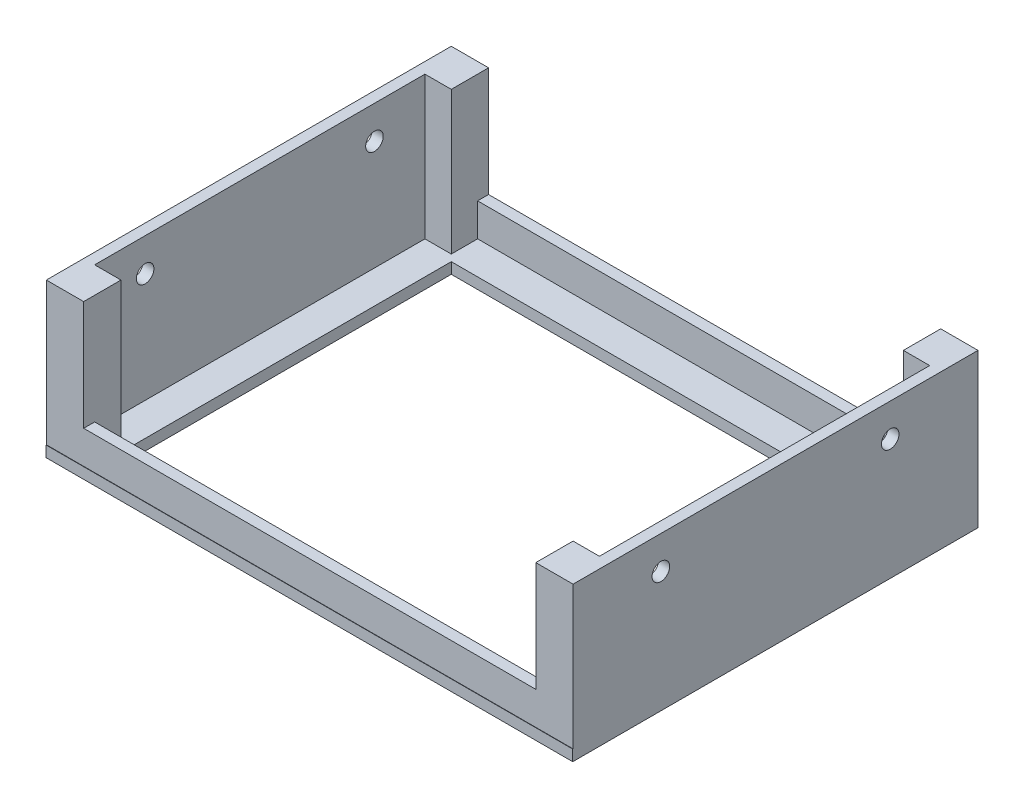
ISO-10303-21;
HEADER;
FILE_DESCRIPTION(('STEP AP214'),'2;1');
FILE_NAME('part.step','',(''),(''),'','','');
FILE_SCHEMA(('AUTOMOTIVE_DESIGN { 1 0 10303 214 1 1 1 1 }'));
ENDSEC;
DATA;
#1=APPLICATION_CONTEXT('core data for automotive mechanical design processes');
#2=APPLICATION_PROTOCOL_DEFINITION('international standard','automotive_design',2000,#1);
#3=PRODUCT_CONTEXT('',#1,'mechanical');
#4=PRODUCT('Part','Part','',(#3));
#5=PRODUCT_RELATED_PRODUCT_CATEGORY('part','',(#4));
#6=PRODUCT_DEFINITION_FORMATION('','',#4);
#7=PRODUCT_DEFINITION_CONTEXT('part definition',#1,'design');
#8=PRODUCT_DEFINITION('design','',#6,#7);
#9=PRODUCT_DEFINITION_SHAPE('','',#8);
#10=(LENGTH_UNIT() NAMED_UNIT(*) SI_UNIT(.MILLI.,.METRE.));
#11=(NAMED_UNIT(*) PLANE_ANGLE_UNIT() SI_UNIT($,.RADIAN.));
#12=(NAMED_UNIT(*) SI_UNIT($,.STERADIAN.) SOLID_ANGLE_UNIT());
#13=UNCERTAINTY_MEASURE_WITH_UNIT(LENGTH_MEASURE(1.E-05),#10,'distance_accuracy_value','');
#14=(GEOMETRIC_REPRESENTATION_CONTEXT(3) GLOBAL_UNCERTAINTY_ASSIGNED_CONTEXT((#13)) GLOBAL_UNIT_ASSIGNED_CONTEXT((#10,
#11,#12)) REPRESENTATION_CONTEXT('',''));
#15=CARTESIAN_POINT('',(0.,0.,0.));
#16=DIRECTION('',(0.,0.,1.));
#17=DIRECTION('',(1.,0.,0.));
#18=AXIS2_PLACEMENT_3D('',#15,#16,#17);
#19=CARTESIAN_POINT('',(120.,70.,92.25));
#20=DIRECTION('',(0.,0.,1.));
#21=DIRECTION('',(1.,0.,0.));
#22=AXIS2_PLACEMENT_3D('',#19,#20,#21);
#23=PLANE('',#22);
#24=DIRECTION('',(0.,-1.,0.));
#25=VECTOR('',#24,1.);
#26=CARTESIAN_POINT('',(-120.,70.,92.25));
#27=LINE('',#26,#25);
#28=CARTESIAN_POINT('',(-120.,70.,92.25));
#29=VERTEX_POINT('',#28);
#30=CARTESIAN_POINT('',(-120.,5.,92.25));
#31=VERTEX_POINT('',#30);
#32=EDGE_CURVE('E511',#29,#31,#27,.T.);
#33=ORIENTED_EDGE('',*,*,#32,.T.);
#34=DIRECTION('',(1.,0.,0.));
#35=VECTOR('',#34,1.);
#36=CARTESIAN_POINT('',(120.,5.,92.25));
#37=LINE('',#36,#35);
#38=CARTESIAN_POINT('',(120.,5.,92.25));
#39=VERTEX_POINT('',#38);
#40=EDGE_CURVE('E398',#31,#39,#37,.T.);
#41=ORIENTED_EDGE('',*,*,#40,.T.);
#42=DIRECTION('',(0.,-1.,0.));
#43=VECTOR('',#42,1.);
#44=CARTESIAN_POINT('',(120.,70.,92.25));
#45=LINE('',#44,#43);
#46=CARTESIAN_POINT('',(120.,70.,92.25));
#47=VERTEX_POINT('',#46);
#48=EDGE_CURVE('E501',#47,#39,#45,.T.);
#49=ORIENTED_EDGE('',*,*,#48,.F.);
#50=DIRECTION('',(-1.,0.,0.));
#51=VECTOR('',#50,1.);
#52=CARTESIAN_POINT('',(120.,70.,92.25));
#53=LINE('',#52,#51);
#54=CARTESIAN_POINT('',(103.,70.,92.25));
#55=VERTEX_POINT('',#54);
#56=EDGE_CURVE('E498',#47,#55,#53,.T.);
#57=ORIENTED_EDGE('',*,*,#56,.T.);
#58=DIRECTION('',(0.,-1.,0.));
#59=VECTOR('',#58,1.);
#60=CARTESIAN_POINT('',(103.,70.,92.25));
#61=LINE('',#60,#59);
#62=CARTESIAN_POINT('',(103.,20.,92.25));
#63=VERTEX_POINT('',#62);
#64=EDGE_CURVE('E401',#55,#63,#61,.T.);
#65=ORIENTED_EDGE('',*,*,#64,.T.);
#66=DIRECTION('',(1.,0.,0.));
#67=VECTOR('',#66,1.);
#68=CARTESIAN_POINT('',(-103.,20.,92.25));
#69=LINE('',#68,#67);
#70=CARTESIAN_POINT('',(-103.,20.,92.25));
#71=VERTEX_POINT('',#70);
#72=EDGE_CURVE('E414',#71,#63,#69,.T.);
#73=ORIENTED_EDGE('',*,*,#72,.F.);
#74=DIRECTION('',(0.,-1.,0.));
#75=VECTOR('',#74,1.);
#76=CARTESIAN_POINT('',(-103.,70.,92.25));
#77=LINE('',#76,#75);
#78=CARTESIAN_POINT('',(-103.,70.,92.25));
#79=VERTEX_POINT('',#78);
#80=EDGE_CURVE('E405',#79,#71,#77,.T.);
#81=ORIENTED_EDGE('',*,*,#80,.F.);
#82=EDGE_CURVE('E497',#79,#29,#53,.T.);
#83=ORIENTED_EDGE('',*,*,#82,.T.);
#84=EDGE_LOOP('',(#33,#41,#49,#57,#65,#73,#81,#83));
#85=FACE_BOUND('',#84,.T.);
#86=ADVANCED_FACE('F104',(#85),#23,.T.);
#87=CARTESIAN_POINT('',(-115.,70.,75.25));
#88=DIRECTION('',(0.,0.,-1.));
#89=DIRECTION('',(-1.,0.,0.));
#90=AXIS2_PLACEMENT_3D('',#87,#88,#89);
#91=PLANE('',#90);
#92=DIRECTION('',(0.,-1.,0.));
#93=VECTOR('',#92,1.);
#94=CARTESIAN_POINT('',(-103.,70.,75.25));
#95=LINE('',#94,#93);
#96=CARTESIAN_POINT('',(-103.,70.,75.25));
#97=VERTEX_POINT('',#96);
#98=CARTESIAN_POINT('',(-103.,5.,75.25));
#99=VERTEX_POINT('',#98);
#100=EDGE_CURVE('E483',#97,#99,#95,.T.);
#101=ORIENTED_EDGE('',*,*,#100,.T.);
#102=DIRECTION('',(-1.,0.,0.));
#103=VECTOR('',#102,1.);
#104=CARTESIAN_POINT('',(-115.,5.,75.25));
#105=LINE('',#104,#103);
#106=CARTESIAN_POINT('',(-115.,5.,75.25));
#107=VERTEX_POINT('',#106);
#108=EDGE_CURVE('E395',#99,#107,#105,.T.);
#109=ORIENTED_EDGE('',*,*,#108,.T.);
#110=DIRECTION('',(0.,-1.,0.));
#111=VECTOR('',#110,1.);
#112=CARTESIAN_POINT('',(-115.,70.,75.25));
#113=LINE('',#112,#111);
#114=CARTESIAN_POINT('',(-115.,70.,75.25));
#115=VERTEX_POINT('',#114);
#116=EDGE_CURVE('E453',#115,#107,#113,.T.);
#117=ORIENTED_EDGE('',*,*,#116,.F.);
#118=DIRECTION('',(1.,0.,0.));
#119=VECTOR('',#118,1.);
#120=CARTESIAN_POINT('',(-115.,70.,75.25));
#121=LINE('',#120,#119);
#122=EDGE_CURVE('E430',#115,#97,#121,.T.);
#123=ORIENTED_EDGE('',*,*,#122,.T.);
#124=EDGE_LOOP('',(#101,#109,#117,#123));
#125=FACE_BOUND('',#124,.T.);
#126=ADVANCED_FACE('F577',(#125),#91,.T.);
#127=CARTESIAN_POINT('',(-103.,70.,75.25));
#128=DIRECTION('',(1.,0.,0.));
#129=DIRECTION('',(0.,0.,-1.));
#130=AXIS2_PLACEMENT_3D('',#127,#128,#129);
#131=PLANE('',#130);
#132=DIRECTION('',(0.,-1.,0.));
#133=VECTOR('',#132,1.);
#134=CARTESIAN_POINT('',(-103.,70.,87.25));
#135=LINE('',#134,#133);
#136=CARTESIAN_POINT('',(-103.,20.,87.25));
#137=VERTEX_POINT('',#136);
#138=CARTESIAN_POINT('',(-103.,5.,87.25));
#139=VERTEX_POINT('',#138);
#140=EDGE_CURVE('E481',#137,#139,#135,.T.);
#141=ORIENTED_EDGE('',*,*,#140,.T.);
#142=DIRECTION('',(0.,0.,-1.));
#143=VECTOR('',#142,1.);
#144=CARTESIAN_POINT('',(-103.,5.,75.25));
#145=LINE('',#144,#143);
#146=EDGE_CURVE('E119',#139,#99,#145,.T.);
#147=ORIENTED_EDGE('',*,*,#146,.T.);
#148=ORIENTED_EDGE('',*,*,#100,.F.);
#149=DIRECTION('',(0.,0.,1.));
#150=VECTOR('',#149,1.);
#151=CARTESIAN_POINT('',(-103.,70.,75.25));
#152=LINE('',#151,#150);
#153=EDGE_CURVE('E432',#97,#79,#152,.T.);
#154=ORIENTED_EDGE('',*,*,#153,.T.);
#155=ORIENTED_EDGE('',*,*,#80,.T.);
#156=DIRECTION('',(0.,0.,1.));
#157=VECTOR('',#156,1.);
#158=CARTESIAN_POINT('',(-103.,20.,-92.25));
#159=LINE('',#158,#157);
#160=EDGE_CURVE('E411',#137,#71,#159,.T.);
#161=ORIENTED_EDGE('',*,*,#160,.F.);
#162=EDGE_LOOP('',(#141,#147,#148,#154,#155,#161));
#163=FACE_BOUND('',#162,.T.);
#164=ADVANCED_FACE('F582',(#163),#131,.T.);
#165=CARTESIAN_POINT('',(103.,70.,87.25));
#166=DIRECTION('',(0.,0.,1.));
#167=DIRECTION('',(1.,0.,0.));
#168=AXIS2_PLACEMENT_3D('',#165,#166,#167);
#169=PLANE('',#168);
#170=DIRECTION('',(1.,0.,0.));
#171=VECTOR('',#170,1.);
#172=CARTESIAN_POINT('',(103.,5.,87.25));
#173=LINE('',#172,#171);
#174=CARTESIAN_POINT('',(103.,5.,87.25));
#175=VERTEX_POINT('',#174);
#176=EDGE_CURVE('E127',#139,#175,#173,.T.);
#177=ORIENTED_EDGE('',*,*,#176,.F.);
#178=ORIENTED_EDGE('',*,*,#140,.F.);
#179=DIRECTION('',(1.,0.,0.));
#180=VECTOR('',#179,1.);
#181=CARTESIAN_POINT('',(103.,20.,87.25));
#182=LINE('',#181,#180);
#183=CARTESIAN_POINT('',(103.,20.,87.25));
#184=VERTEX_POINT('',#183);
#185=EDGE_CURVE('E427',#137,#184,#182,.T.);
#186=ORIENTED_EDGE('',*,*,#185,.T.);
#187=DIRECTION('',(0.,-1.,0.));
#188=VECTOR('',#187,1.);
#189=CARTESIAN_POINT('',(103.,70.,87.25));
#190=LINE('',#189,#188);
#191=EDGE_CURVE('E479',#184,#175,#190,.T.);
#192=ORIENTED_EDGE('',*,*,#191,.T.);
#193=EDGE_LOOP('',(#177,#178,#186,#192));
#194=FACE_BOUND('',#193,.T.);
#195=ADVANCED_FACE('F606',(#194),#169,.F.);
#196=CARTESIAN_POINT('',(103.,70.,75.25));
#197=DIRECTION('',(1.,0.,0.));
#198=DIRECTION('',(0.,0.,-1.));
#199=AXIS2_PLACEMENT_3D('',#196,#197,#198);
#200=PLANE('',#199);
#201=DIRECTION('',(0.,0.,-1.));
#202=VECTOR('',#201,1.);
#203=CARTESIAN_POINT('',(103.,5.,75.25));
#204=LINE('',#203,#202);
#205=CARTESIAN_POINT('',(103.,5.,75.25));
#206=VERTEX_POINT('',#205);
#207=EDGE_CURVE('E390',#175,#206,#204,.T.);
#208=ORIENTED_EDGE('',*,*,#207,.F.);
#209=ORIENTED_EDGE('',*,*,#191,.F.);
#210=DIRECTION('',(0.,0.,1.));
#211=VECTOR('',#210,1.);
#212=CARTESIAN_POINT('',(103.,20.,-92.25));
#213=LINE('',#212,#211);
#214=EDGE_CURVE('E421',#184,#63,#213,.T.);
#215=ORIENTED_EDGE('',*,*,#214,.T.);
#216=ORIENTED_EDGE('',*,*,#64,.F.);
#217=DIRECTION('',(0.,0.,1.));
#218=VECTOR('',#217,1.);
#219=CARTESIAN_POINT('',(103.,70.,75.25));
#220=LINE('',#219,#218);
#221=CARTESIAN_POINT('',(103.,70.,75.25));
#222=VERTEX_POINT('',#221);
#223=EDGE_CURVE('E434',#222,#55,#220,.T.);
#224=ORIENTED_EDGE('',*,*,#223,.F.);
#225=DIRECTION('',(0.,-1.,0.));
#226=VECTOR('',#225,1.);
#227=CARTESIAN_POINT('',(103.,70.,75.25));
#228=LINE('',#227,#226);
#229=EDGE_CURVE('E476',#222,#206,#228,.T.);
#230=ORIENTED_EDGE('',*,*,#229,.T.);
#231=EDGE_LOOP('',(#208,#209,#215,#216,#224,#230));
#232=FACE_BOUND('',#231,.T.);
#233=ADVANCED_FACE('F609',(#232),#200,.F.);
#234=CARTESIAN_POINT('',(115.,70.,75.25));
#235=DIRECTION('',(0.,0.,1.));
#236=DIRECTION('',(1.,0.,0.));
#237=AXIS2_PLACEMENT_3D('',#234,#235,#236);
#238=PLANE('',#237);
#239=DIRECTION('',(1.,0.,0.));
#240=VECTOR('',#239,1.);
#241=CARTESIAN_POINT('',(115.,5.,75.25));
#242=LINE('',#241,#240);
#243=CARTESIAN_POINT('',(115.,5.,75.25));
#244=VERTEX_POINT('',#243);
#245=EDGE_CURVE('E387',#206,#244,#242,.T.);
#246=ORIENTED_EDGE('',*,*,#245,.F.);
#247=ORIENTED_EDGE('',*,*,#229,.F.);
#248=DIRECTION('',(-1.,0.,0.));
#249=VECTOR('',#248,1.);
#250=CARTESIAN_POINT('',(115.,70.,75.25));
#251=LINE('',#250,#249);
#252=CARTESIAN_POINT('',(115.,70.,75.25));
#253=VERTEX_POINT('',#252);
#254=EDGE_CURVE('E436',#253,#222,#251,.T.);
#255=ORIENTED_EDGE('',*,*,#254,.F.);
#256=DIRECTION('',(0.,-1.,0.));
#257=VECTOR('',#256,1.);
#258=CARTESIAN_POINT('',(115.,70.,75.25));
#259=LINE('',#258,#257);
#260=EDGE_CURVE('E473',#253,#244,#259,.T.);
#261=ORIENTED_EDGE('',*,*,#260,.T.);
#262=EDGE_LOOP('',(#246,#247,#255,#261));
#263=FACE_BOUND('',#262,.T.);
#264=ADVANCED_FACE('F612',(#263),#238,.F.);
#265=CARTESIAN_POINT('',(115.,70.,75.25));
#266=DIRECTION('',(-1.,0.,0.));
#267=DIRECTION('',(0.,0.,1.));
#268=AXIS2_PLACEMENT_3D('',#265,#266,#267);
#269=PLANE('',#268);
#270=CARTESIAN_POINT('',(115.,55.,52.25));
#271=DIRECTION('',(-1.,0.,0.));
#272=DIRECTION('',(0.,0.,1.));
#273=AXIS2_PLACEMENT_3D('',#270,#271,#272);
#274=CIRCLE('',#273,3.99999999999998);
#275=CARTESIAN_POINT('',(115.,55.,56.25));
#276=VERTEX_POINT('',#275);
#277=EDGE_CURVE('E841',#276,#276,#274,.T.);
#278=ORIENTED_EDGE('',*,*,#277,.F.);
#279=EDGE_LOOP('',(#278));
#280=FACE_BOUND('',#279,.T.);
#281=CARTESIAN_POINT('',(115.,55.,-52.25));
#282=DIRECTION('',(-1.,0.,0.));
#283=DIRECTION('',(0.,0.,1.));
#284=AXIS2_PLACEMENT_3D('',#281,#282,#283);
#285=CIRCLE('',#284,3.99999999999998);
#286=CARTESIAN_POINT('',(115.,55.,-48.2500000000001));
#287=VERTEX_POINT('',#286);
#288=EDGE_CURVE('E307',#287,#287,#285,.T.);
#289=ORIENTED_EDGE('',*,*,#288,.F.);
#290=EDGE_LOOP('',(#289));
#291=FACE_BOUND('',#290,.T.);
#292=DIRECTION('',(0.,-1.,0.));
#293=VECTOR('',#292,1.);
#294=CARTESIAN_POINT('',(115.,70.,-75.25));
#295=LINE('',#294,#293);
#296=CARTESIAN_POINT('',(115.,70.,-75.25));
#297=VERTEX_POINT('',#296);
#298=CARTESIAN_POINT('',(115.,5.,-75.25));
#299=VERTEX_POINT('',#298);
#300=EDGE_CURVE('E470',#297,#299,#295,.T.);
#301=ORIENTED_EDGE('',*,*,#300,.T.);
#302=DIRECTION('',(0.,0.,1.));
#303=VECTOR('',#302,1.);
#304=CARTESIAN_POINT('',(115.,5.,75.25));
#305=LINE('',#304,#303);
#306=EDGE_CURVE('E385',#299,#244,#305,.T.);
#307=ORIENTED_EDGE('',*,*,#306,.T.);
#308=ORIENTED_EDGE('',*,*,#260,.F.);
#309=DIRECTION('',(0.,0.,-1.));
#310=VECTOR('',#309,1.);
#311=CARTESIAN_POINT('',(115.,70.,75.25));
#312=LINE('',#311,#310);
#313=EDGE_CURVE('E439',#253,#297,#312,.T.);
#314=ORIENTED_EDGE('',*,*,#313,.T.);
#315=EDGE_LOOP('',(#301,#307,#308,#314));
#316=FACE_BOUND('',#315,.T.);
#317=ADVANCED_FACE('F616',(#280,#291,#316),#269,.T.);
#318=CARTESIAN_POINT('',(115.,70.,-75.25));
#319=DIRECTION('',(0.,0.,1.));
#320=DIRECTION('',(1.,0.,0.));
#321=AXIS2_PLACEMENT_3D('',#318,#319,#320);
#322=PLANE('',#321);
#323=DIRECTION('',(0.,-1.,0.));
#324=VECTOR('',#323,1.);
#325=CARTESIAN_POINT('',(103.,70.,-75.25));
#326=LINE('',#325,#324);
#327=CARTESIAN_POINT('',(103.,70.,-75.25));
#328=VERTEX_POINT('',#327);
#329=CARTESIAN_POINT('',(103.,5.,-75.25));
#330=VERTEX_POINT('',#329);
#331=EDGE_CURVE('E467',#328,#330,#326,.T.);
#332=ORIENTED_EDGE('',*,*,#331,.T.);
#333=DIRECTION('',(1.,0.,0.));
#334=VECTOR('',#333,1.);
#335=CARTESIAN_POINT('',(115.,5.,-75.25));
#336=LINE('',#335,#334);
#337=EDGE_CURVE('E383',#330,#299,#336,.T.);
#338=ORIENTED_EDGE('',*,*,#337,.T.);
#339=ORIENTED_EDGE('',*,*,#300,.F.);
#340=DIRECTION('',(-1.,0.,0.));
#341=VECTOR('',#340,1.);
#342=CARTESIAN_POINT('',(115.,70.,-75.25));
#343=LINE('',#342,#341);
#344=EDGE_CURVE('E441',#297,#328,#343,.T.);
#345=ORIENTED_EDGE('',*,*,#344,.T.);
#346=EDGE_LOOP('',(#332,#338,#339,#345));
#347=FACE_BOUND('',#346,.T.);
#348=ADVANCED_FACE('F620',(#347),#322,.T.);
#349=CARTESIAN_POINT('',(103.,70.,-75.25));
#350=DIRECTION('',(-1.,0.,0.));
#351=DIRECTION('',(0.,0.,1.));
#352=AXIS2_PLACEMENT_3D('',#349,#350,#351);
#353=PLANE('',#352);
#354=DIRECTION('',(0.,-1.,0.));
#355=VECTOR('',#354,1.);
#356=CARTESIAN_POINT('',(103.,70.,-87.25));
#357=LINE('',#356,#355);
#358=CARTESIAN_POINT('',(103.,20.,-87.25));
#359=VERTEX_POINT('',#358);
#360=CARTESIAN_POINT('',(103.,5.,-87.25));
#361=VERTEX_POINT('',#360);
#362=EDGE_CURVE('E464',#359,#361,#357,.T.);
#363=ORIENTED_EDGE('',*,*,#362,.T.);
#364=DIRECTION('',(0.,0.,1.));
#365=VECTOR('',#364,1.);
#366=CARTESIAN_POINT('',(103.,5.,-75.25));
#367=LINE('',#366,#365);
#368=EDGE_CURVE('E381',#361,#330,#367,.T.);
#369=ORIENTED_EDGE('',*,*,#368,.T.);
#370=ORIENTED_EDGE('',*,*,#331,.F.);
#371=DIRECTION('',(0.,0.,-1.));
#372=VECTOR('',#371,1.);
#373=CARTESIAN_POINT('',(103.,70.,-75.25));
#374=LINE('',#373,#372);
#375=CARTESIAN_POINT('',(103.,70.,-92.25));
#376=VERTEX_POINT('',#375);
#377=EDGE_CURVE('E443',#328,#376,#374,.T.);
#378=ORIENTED_EDGE('',*,*,#377,.T.);
#379=DIRECTION('',(0.,-1.,0.));
#380=VECTOR('',#379,1.);
#381=CARTESIAN_POINT('',(103.,70.,-92.25));
#382=LINE('',#381,#380);
#383=CARTESIAN_POINT('',(103.,20.,-92.25));
#384=VERTEX_POINT('',#383);
#385=EDGE_CURVE('E402',#376,#384,#382,.T.);
#386=ORIENTED_EDGE('',*,*,#385,.T.);
#387=EDGE_CURVE('E422',#384,#359,#213,.T.);
#388=ORIENTED_EDGE('',*,*,#387,.T.);
#389=EDGE_LOOP('',(#363,#369,#370,#378,#386,#388));
#390=FACE_BOUND('',#389,.T.);
#391=ADVANCED_FACE('F624',(#390),#353,.T.);
#392=CARTESIAN_POINT('',(103.,70.,-87.25));
#393=DIRECTION('',(0.,0.,1.));
#394=DIRECTION('',(1.,0.,0.));
#395=AXIS2_PLACEMENT_3D('',#392,#393,#394);
#396=PLANE('',#395);
#397=DIRECTION('',(0.,-1.,0.));
#398=VECTOR('',#397,1.);
#399=CARTESIAN_POINT('',(-103.,70.,-87.25));
#400=LINE('',#399,#398);
#401=CARTESIAN_POINT('',(-103.,20.,-87.25));
#402=VERTEX_POINT('',#401);
#403=CARTESIAN_POINT('',(-103.,5.,-87.25));
#404=VERTEX_POINT('',#403);
#405=EDGE_CURVE('E461',#402,#404,#400,.T.);
#406=ORIENTED_EDGE('',*,*,#405,.T.);
#407=DIRECTION('',(1.,0.,0.));
#408=VECTOR('',#407,1.);
#409=CARTESIAN_POINT('',(103.,5.,-87.25));
#410=LINE('',#409,#408);
#411=EDGE_CURVE('E379',#404,#361,#410,.T.);
#412=ORIENTED_EDGE('',*,*,#411,.T.);
#413=ORIENTED_EDGE('',*,*,#362,.F.);
#414=DIRECTION('',(1.,0.,0.));
#415=VECTOR('',#414,1.);
#416=CARTESIAN_POINT('',(103.,20.,-87.25));
#417=LINE('',#416,#415);
#418=EDGE_CURVE('E425',#402,#359,#417,.T.);
#419=ORIENTED_EDGE('',*,*,#418,.F.);
#420=EDGE_LOOP('',(#406,#412,#413,#419));
#421=FACE_BOUND('',#420,.T.);
#422=ADVANCED_FACE('F628',(#421),#396,.T.);
#423=CARTESIAN_POINT('',(-103.,70.,-75.25));
#424=DIRECTION('',(-1.,0.,0.));
#425=DIRECTION('',(0.,0.,1.));
#426=AXIS2_PLACEMENT_3D('',#423,#424,#425);
#427=PLANE('',#426);
#428=DIRECTION('',(0.,0.,1.));
#429=VECTOR('',#428,1.);
#430=CARTESIAN_POINT('',(-103.,5.,-75.25));
#431=LINE('',#430,#429);
#432=CARTESIAN_POINT('',(-103.,5.,-75.25));
#433=VERTEX_POINT('',#432);
#434=EDGE_CURVE('E376',#404,#433,#431,.T.);
#435=ORIENTED_EDGE('',*,*,#434,.F.);
#436=ORIENTED_EDGE('',*,*,#405,.F.);
#437=CARTESIAN_POINT('',(-103.,20.,-92.25));
#438=VERTEX_POINT('',#437);
#439=EDGE_CURVE('E419',#438,#402,#159,.T.);
#440=ORIENTED_EDGE('',*,*,#439,.F.);
#441=DIRECTION('',(0.,-1.,0.));
#442=VECTOR('',#441,1.);
#443=CARTESIAN_POINT('',(-103.,70.,-92.25));
#444=LINE('',#443,#442);
#445=CARTESIAN_POINT('',(-103.,70.,-92.25));
#446=VERTEX_POINT('',#445);
#447=EDGE_CURVE('E408',#446,#438,#444,.T.);
#448=ORIENTED_EDGE('',*,*,#447,.F.);
#449=DIRECTION('',(0.,0.,-1.));
#450=VECTOR('',#449,1.);
#451=CARTESIAN_POINT('',(-103.,70.,-75.25));
#452=LINE('',#451,#450);
#453=CARTESIAN_POINT('',(-103.,70.,-75.25));
#454=VERTEX_POINT('',#453);
#455=EDGE_CURVE('E445',#454,#446,#452,.T.);
#456=ORIENTED_EDGE('',*,*,#455,.F.);
#457=DIRECTION('',(0.,-1.,0.));
#458=VECTOR('',#457,1.);
#459=CARTESIAN_POINT('',(-103.,70.,-75.25));
#460=LINE('',#459,#458);
#461=EDGE_CURVE('E458',#454,#433,#460,.T.);
#462=ORIENTED_EDGE('',*,*,#461,.T.);
#463=EDGE_LOOP('',(#435,#436,#440,#448,#456,#462));
#464=FACE_BOUND('',#463,.T.);
#465=ADVANCED_FACE('F544',(#464),#427,.F.);
#466=CARTESIAN_POINT('',(-115.,70.,-75.25));
#467=DIRECTION('',(0.,0.,-1.));
#468=DIRECTION('',(-1.,0.,0.));
#469=AXIS2_PLACEMENT_3D('',#466,#467,#468);
#470=PLANE('',#469);
#471=DIRECTION('',(-1.,0.,0.));
#472=VECTOR('',#471,1.);
#473=CARTESIAN_POINT('',(-115.,5.,-75.25));
#474=LINE('',#473,#472);
#475=CARTESIAN_POINT('',(-115.,5.,-75.25));
#476=VERTEX_POINT('',#475);
#477=EDGE_CURVE('E371',#433,#476,#474,.T.);
#478=ORIENTED_EDGE('',*,*,#477,.F.);
#479=ORIENTED_EDGE('',*,*,#461,.F.);
#480=DIRECTION('',(1.,0.,0.));
#481=VECTOR('',#480,1.);
#482=CARTESIAN_POINT('',(-115.,70.,-75.25));
#483=LINE('',#482,#481);
#484=CARTESIAN_POINT('',(-115.,70.,-75.25));
#485=VERTEX_POINT('',#484);
#486=EDGE_CURVE('E447',#485,#454,#483,.T.);
#487=ORIENTED_EDGE('',*,*,#486,.F.);
#488=DIRECTION('',(0.,-1.,0.));
#489=VECTOR('',#488,1.);
#490=CARTESIAN_POINT('',(-115.,70.,-75.25));
#491=LINE('',#490,#489);
#492=EDGE_CURVE('E455',#485,#476,#491,.T.);
#493=ORIENTED_EDGE('',*,*,#492,.T.);
#494=EDGE_LOOP('',(#478,#479,#487,#493));
#495=FACE_BOUND('',#494,.T.);
#496=ADVANCED_FACE('F600',(#495),#470,.F.);
#497=CARTESIAN_POINT('',(-115.,70.,75.25));
#498=DIRECTION('',(-1.,0.,0.));
#499=DIRECTION('',(0.,0.,1.));
#500=AXIS2_PLACEMENT_3D('',#497,#498,#499);
#501=PLANE('',#500);
#502=CARTESIAN_POINT('',(-115.,55.,52.25));
#503=DIRECTION('',(-1.,0.,0.));
#504=DIRECTION('',(0.,0.,1.));
#505=AXIS2_PLACEMENT_3D('',#502,#503,#504);
#506=CIRCLE('',#505,3.99999999999998);
#507=CARTESIAN_POINT('',(-115.,55.,56.25));
#508=VERTEX_POINT('',#507);
#509=EDGE_CURVE('E845',#508,#508,#506,.T.);
#510=ORIENTED_EDGE('',*,*,#509,.T.);
#511=EDGE_LOOP('',(#510));
#512=FACE_BOUND('',#511,.T.);
#513=CARTESIAN_POINT('',(-115.,55.,-52.25));
#514=DIRECTION('',(-1.,0.,0.));
#515=DIRECTION('',(0.,0.,1.));
#516=AXIS2_PLACEMENT_3D('',#513,#514,#515);
#517=CIRCLE('',#516,3.99999999999998);
#518=CARTESIAN_POINT('',(-115.,55.,-48.25));
#519=VERTEX_POINT('',#518);
#520=EDGE_CURVE('E860',#519,#519,#517,.T.);
#521=ORIENTED_EDGE('',*,*,#520,.T.);
#522=EDGE_LOOP('',(#521));
#523=FACE_BOUND('',#522,.T.);
#524=DIRECTION('',(0.,0.,1.));
#525=VECTOR('',#524,1.);
#526=CARTESIAN_POINT('',(-115.,5.,75.25));
#527=LINE('',#526,#525);
#528=EDGE_CURVE('E12',#476,#107,#527,.T.);
#529=ORIENTED_EDGE('',*,*,#528,.F.);
#530=ORIENTED_EDGE('',*,*,#492,.F.);
#531=DIRECTION('',(0.,0.,-1.));
#532=VECTOR('',#531,1.);
#533=CARTESIAN_POINT('',(-115.,70.,75.25));
#534=LINE('',#533,#532);
#535=EDGE_CURVE('E450',#115,#485,#534,.T.);
#536=ORIENTED_EDGE('',*,*,#535,.F.);
#537=ORIENTED_EDGE('',*,*,#116,.T.);
#538=EDGE_LOOP('',(#529,#530,#536,#537));
#539=FACE_BOUND('',#538,.T.);
#540=ADVANCED_FACE('F595',(#512,#523,#539),#501,.F.);
#541=CARTESIAN_POINT('',(0.,70.,0.));
#542=DIRECTION('',(0.,1.,0.));
#543=DIRECTION('',(0.,0.,1.));
#544=AXIS2_PLACEMENT_3D('',#541,#542,#543);
#545=PLANE('',#544);
#546=DIRECTION('',(-1.,0.,0.));
#547=VECTOR('',#546,1.);
#548=CARTESIAN_POINT('',(120.,70.,-92.25));
#549=LINE('',#548,#547);
#550=CARTESIAN_POINT('',(120.,70.,-92.25));
#551=VERTEX_POINT('',#550);
#552=EDGE_CURVE('E491',#551,#376,#549,.T.);
#553=ORIENTED_EDGE('',*,*,#552,.T.);
#554=ORIENTED_EDGE('',*,*,#377,.F.);
#555=ORIENTED_EDGE('',*,*,#344,.F.);
#556=ORIENTED_EDGE('',*,*,#313,.F.);
#557=ORIENTED_EDGE('',*,*,#254,.T.);
#558=ORIENTED_EDGE('',*,*,#223,.T.);
#559=ORIENTED_EDGE('',*,*,#56,.F.);
#560=DIRECTION('',(0.,0.,-1.));
#561=VECTOR('',#560,1.);
#562=CARTESIAN_POINT('',(120.,70.,92.25));
#563=LINE('',#562,#561);
#564=EDGE_CURVE('E486',#47,#551,#563,.T.);
#565=ORIENTED_EDGE('',*,*,#564,.T.);
#566=EDGE_LOOP('',(#553,#554,#555,#556,#557,#558,#559,#565));
#567=FACE_BOUND('',#566,.T.);
#568=ADVANCED_FACE('F554',(#567),#545,.T.);
#569=CARTESIAN_POINT('',(120.,70.,-92.25));
#570=DIRECTION('',(0.,0.,1.));
#571=DIRECTION('',(1.,0.,0.));
#572=AXIS2_PLACEMENT_3D('',#569,#570,#571);
#573=PLANE('',#572);
#574=DIRECTION('',(-1.,0.,0.));
#575=VECTOR('',#574,1.);
#576=CARTESIAN_POINT('',(120.,0.,-92.25));
#577=LINE('',#576,#575);
#578=CARTESIAN_POINT('',(120.,0.,-92.25));
#579=VERTEX_POINT('',#578);
#580=CARTESIAN_POINT('',(-120.,0.,-92.25));
#581=VERTEX_POINT('',#580);
#582=EDGE_CURVE('E504',#579,#581,#577,.T.);
#583=ORIENTED_EDGE('',*,*,#582,.T.);
#584=DIRECTION('',(0.,-1.,0.));
#585=VECTOR('',#584,1.);
#586=CARTESIAN_POINT('',(-120.,70.,-92.25));
#587=LINE('',#586,#585);
#588=CARTESIAN_POINT('',(-120.,70.,-92.25));
#589=VERTEX_POINT('',#588);
#590=EDGE_CURVE('E514',#589,#581,#587,.T.);
#591=ORIENTED_EDGE('',*,*,#590,.F.);
#592=EDGE_CURVE('E489',#446,#589,#549,.T.);
#593=ORIENTED_EDGE('',*,*,#592,.F.);
#594=ORIENTED_EDGE('',*,*,#447,.T.);
#595=DIRECTION('',(1.,0.,0.));
#596=VECTOR('',#595,1.);
#597=CARTESIAN_POINT('',(-103.,20.,-92.25));
#598=LINE('',#597,#596);
#599=EDGE_CURVE('E404',#438,#384,#598,.T.);
#600=ORIENTED_EDGE('',*,*,#599,.T.);
#601=ORIENTED_EDGE('',*,*,#385,.F.);
#602=ORIENTED_EDGE('',*,*,#552,.F.);
#603=DIRECTION('',(0.,-1.,0.));
#604=VECTOR('',#603,1.);
#605=CARTESIAN_POINT('',(120.,70.,-92.25));
#606=LINE('',#605,#604);
#607=EDGE_CURVE('E112',#551,#579,#606,.T.);
#608=ORIENTED_EDGE('',*,*,#607,.T.);
#609=EDGE_LOOP('',(#583,#591,#593,#594,#600,#601,#602,#608));
#610=FACE_BOUND('',#609,.T.);
#611=ADVANCED_FACE('F518',(#610),#573,.F.);
#612=ORIENTED_EDGE('',*,*,#455,.T.);
#613=ORIENTED_EDGE('',*,*,#592,.T.);
#614=DIRECTION('',(0.,0.,-1.));
#615=VECTOR('',#614,1.);
#616=CARTESIAN_POINT('',(-120.,70.,92.25));
#617=LINE('',#616,#615);
#618=EDGE_CURVE('E494',#29,#589,#617,.T.);
#619=ORIENTED_EDGE('',*,*,#618,.F.);
#620=ORIENTED_EDGE('',*,*,#82,.F.);
#621=ORIENTED_EDGE('',*,*,#153,.F.);
#622=ORIENTED_EDGE('',*,*,#122,.F.);
#623=ORIENTED_EDGE('',*,*,#535,.T.);
#624=ORIENTED_EDGE('',*,*,#486,.T.);
#625=EDGE_LOOP('',(#612,#613,#619,#620,#621,#622,#623,#624));
#626=FACE_BOUND('',#625,.T.);
#627=ADVANCED_FACE('F540',(#626),#545,.T.);
#628=CARTESIAN_POINT('',(0.,0.,0.));
#629=DIRECTION('',(0.,1.,0.));
#630=DIRECTION('',(0.,0.,1.));
#631=AXIS2_PLACEMENT_3D('',#628,#629,#630);
#632=PLANE('',#631);
#633=CARTESIAN_POINT('',(-107.5,0.,79.7499999999999));
#634=DIRECTION('',(0.,-1.,0.));
#635=DIRECTION('',(0.,0.,-1.));
#636=AXIS2_PLACEMENT_3D('',#633,#634,#635);
#637=CIRCLE('',#636,1.64999999999998);
#638=CARTESIAN_POINT('',(-107.5,0.,78.1));
#639=VERTEX_POINT('',#638);
#640=EDGE_CURVE('E301',#639,#639,#637,.T.);
#641=ORIENTED_EDGE('',*,*,#640,.F.);
#642=EDGE_LOOP('',(#641));
#643=FACE_BOUND('',#642,.T.);
#644=CARTESIAN_POINT('',(107.5,0.,79.75));
#645=DIRECTION('',(0.,-1.,0.));
#646=DIRECTION('',(0.,0.,-1.));
#647=AXIS2_PLACEMENT_3D('',#644,#645,#646);
#648=CIRCLE('',#647,1.64999999999998);
#649=CARTESIAN_POINT('',(107.5,0.,78.1));
#650=VERTEX_POINT('',#649);
#651=EDGE_CURVE('E300',#650,#650,#648,.T.);
#652=ORIENTED_EDGE('',*,*,#651,.F.);
#653=EDGE_LOOP('',(#652));
#654=FACE_BOUND('',#653,.T.);
#655=CARTESIAN_POINT('',(-107.5,0.,-79.7499999999999));
#656=DIRECTION('',(0.,-1.,0.));
#657=DIRECTION('',(0.,0.,-1.));
#658=AXIS2_PLACEMENT_3D('',#655,#656,#657);
#659=CIRCLE('',#658,1.64999999999998);
#660=CARTESIAN_POINT('',(-107.5,0.,-81.3999999999999));
#661=VERTEX_POINT('',#660);
#662=EDGE_CURVE('E313',#661,#661,#659,.T.);
#663=ORIENTED_EDGE('',*,*,#662,.F.);
#664=EDGE_LOOP('',(#663));
#665=FACE_BOUND('',#664,.T.);
#666=CARTESIAN_POINT('',(107.5,0.,-79.75));
#667=DIRECTION('',(0.,-1.,0.));
#668=DIRECTION('',(0.,0.,-1.));
#669=AXIS2_PLACEMENT_3D('',#666,#667,#668);
#670=CIRCLE('',#669,1.64999999999998);
#671=CARTESIAN_POINT('',(107.5,0.,-81.3999999999999));
#672=VERTEX_POINT('',#671);
#673=EDGE_CURVE('E319',#672,#672,#670,.T.);
#674=ORIENTED_EDGE('',*,*,#673,.F.);
#675=EDGE_LOOP('',(#674));
#676=FACE_BOUND('',#675,.T.);
#677=DIRECTION('',(0.,0.,-1.));
#678=VECTOR('',#677,1.);
#679=CARTESIAN_POINT('',(120.,0.,92.25));
#680=LINE('',#679,#678);
#681=CARTESIAN_POINT('',(120.,0.,92.4121782937661));
#682=VERTEX_POINT('',#681);
#683=EDGE_CURVE('E485',#682,#579,#680,.T.);
#684=ORIENTED_EDGE('',*,*,#683,.F.);
#685=DIRECTION('',(1.,0.,0.));
#686=VECTOR('',#685,1.);
#687=CARTESIAN_POINT('',(-120.,0.,92.4121782937661));
#688=LINE('',#687,#686);
#689=CARTESIAN_POINT('',(-120.,0.,92.4121782937661));
#690=VERTEX_POINT('',#689);
#691=EDGE_CURVE('E357',#690,#682,#688,.T.);
#692=ORIENTED_EDGE('',*,*,#691,.F.);
#693=DIRECTION('',(0.,0.,-1.));
#694=VECTOR('',#693,1.);
#695=CARTESIAN_POINT('',(-120.,0.,92.25));
#696=LINE('',#695,#694);
#697=EDGE_CURVE('E490',#690,#581,#696,.T.);
#698=ORIENTED_EDGE('',*,*,#697,.T.);
#699=ORIENTED_EDGE('',*,*,#582,.F.);
#700=EDGE_LOOP('',(#684,#692,#698,#699));
#701=FACE_BOUND('',#700,.T.);
#702=DIRECTION('',(-1.,0.,0.));
#703=VECTOR('',#702,1.);
#704=CARTESIAN_POINT('',(100.,0.,72.25));
#705=LINE('',#704,#703);
#706=CARTESIAN_POINT('',(100.,0.,72.25));
#707=VERTEX_POINT('',#706);
#708=CARTESIAN_POINT('',(-100.,0.,72.25));
#709=VERTEX_POINT('',#708);
#710=EDGE_CURVE('E329',#707,#709,#705,.T.);
#711=ORIENTED_EDGE('',*,*,#710,.F.);
#712=DIRECTION('',(0.,0.,-1.));
#713=VECTOR('',#712,1.);
#714=CARTESIAN_POINT('',(100.,0.,72.25));
#715=LINE('',#714,#713);
#716=CARTESIAN_POINT('',(100.,0.,-72.25));
#717=VERTEX_POINT('',#716);
#718=EDGE_CURVE('E325',#707,#717,#715,.T.);
#719=ORIENTED_EDGE('',*,*,#718,.T.);
#720=DIRECTION('',(-1.,0.,0.));
#721=VECTOR('',#720,1.);
#722=CARTESIAN_POINT('',(100.,0.,-72.25));
#723=LINE('',#722,#721);
#724=CARTESIAN_POINT('',(-100.,0.,-72.25));
#725=VERTEX_POINT('',#724);
#726=EDGE_CURVE('E340',#717,#725,#723,.T.);
#727=ORIENTED_EDGE('',*,*,#726,.T.);
#728=DIRECTION('',(0.,0.,-1.));
#729=VECTOR('',#728,1.);
#730=CARTESIAN_POINT('',(-100.,0.,72.25));
#731=LINE('',#730,#729);
#732=EDGE_CURVE('E343',#709,#725,#731,.T.);
#733=ORIENTED_EDGE('',*,*,#732,.F.);
#734=EDGE_LOOP('',(#711,#719,#727,#733));
#735=FACE_BOUND('',#734,.T.);
#736=ADVANCED_FACE('F524',(#643,#654,#665,#676,#701,#735),#632,.F.);
#737=CARTESIAN_POINT('',(120.,70.,92.25));
#738=DIRECTION('',(-1.,0.,0.));
#739=DIRECTION('',(0.,0.,1.));
#740=AXIS2_PLACEMENT_3D('',#737,#738,#739);
#741=PLANE('',#740);
#742=CARTESIAN_POINT('',(120.,55.,52.25));
#743=DIRECTION('',(-1.,0.,0.));
#744=DIRECTION('',(0.,0.,1.));
#745=AXIS2_PLACEMENT_3D('',#742,#743,#744);
#746=CIRCLE('',#745,3.99999999999997);
#747=CARTESIAN_POINT('',(120.,55.,56.25));
#748=VERTEX_POINT('',#747);
#749=EDGE_CURVE('E844',#748,#748,#746,.T.);
#750=ORIENTED_EDGE('',*,*,#749,.T.);
#751=EDGE_LOOP('',(#750));
#752=FACE_BOUND('',#751,.T.);
#753=CARTESIAN_POINT('',(120.,55.,-52.25));
#754=DIRECTION('',(-1.,0.,0.));
#755=DIRECTION('',(0.,0.,1.));
#756=AXIS2_PLACEMENT_3D('',#753,#754,#755);
#757=CIRCLE('',#756,3.99999999999997);
#758=CARTESIAN_POINT('',(120.,55.,-48.2500000000001));
#759=VERTEX_POINT('',#758);
#760=EDGE_CURVE('E857',#759,#759,#757,.T.);
#761=ORIENTED_EDGE('',*,*,#760,.T.);
#762=EDGE_LOOP('',(#761));
#763=FACE_BOUND('',#762,.T.);
#764=ORIENTED_EDGE('',*,*,#683,.T.);
#765=ORIENTED_EDGE('',*,*,#607,.F.);
#766=ORIENTED_EDGE('',*,*,#564,.F.);
#767=ORIENTED_EDGE('',*,*,#48,.T.);
#768=DIRECTION('',(0.,0.,1.));
#769=VECTOR('',#768,1.);
#770=CARTESIAN_POINT('',(120.,5.,-92.25));
#771=LINE('',#770,#769);
#772=CARTESIAN_POINT('',(120.,5.,92.4121782937661));
#773=VERTEX_POINT('',#772);
#774=EDGE_CURVE('E358',#39,#773,#771,.T.);
#775=ORIENTED_EDGE('',*,*,#774,.T.);
#776=DIRECTION('',(0.,-1.,0.));
#777=VECTOR('',#776,1.);
#778=CARTESIAN_POINT('',(120.,5.,92.4121782937661));
#779=LINE('',#778,#777);
#780=EDGE_CURVE('E365',#773,#682,#779,.T.);
#781=ORIENTED_EDGE('',*,*,#780,.T.);
#782=EDGE_LOOP('',(#764,#765,#766,#767,#775,#781));
#783=FACE_BOUND('',#782,.T.);
#784=ADVANCED_FACE('F106',(#752,#763,#783),#741,.F.);
#785=CARTESIAN_POINT('',(-120.,70.,92.25));
#786=DIRECTION('',(-1.,0.,0.));
#787=DIRECTION('',(0.,0.,1.));
#788=AXIS2_PLACEMENT_3D('',#785,#786,#787);
#789=PLANE('',#788);
#790=CARTESIAN_POINT('',(-120.,55.,52.25));
#791=DIRECTION('',(-1.,0.,0.));
#792=DIRECTION('',(0.,0.,1.));
#793=AXIS2_PLACEMENT_3D('',#790,#791,#792);
#794=CIRCLE('',#793,3.99999999999999);
#795=CARTESIAN_POINT('',(-120.,55.,56.25));
#796=VERTEX_POINT('',#795);
#797=EDGE_CURVE('E846',#796,#796,#794,.T.);
#798=ORIENTED_EDGE('',*,*,#797,.F.);
#799=EDGE_LOOP('',(#798));
#800=FACE_BOUND('',#799,.T.);
#801=CARTESIAN_POINT('',(-120.,55.,-52.25));
#802=DIRECTION('',(-1.,0.,0.));
#803=DIRECTION('',(0.,0.,1.));
#804=AXIS2_PLACEMENT_3D('',#801,#802,#803);
#805=CIRCLE('',#804,3.99999999999999);
#806=CARTESIAN_POINT('',(-120.,55.,-48.25));
#807=VERTEX_POINT('',#806);
#808=EDGE_CURVE('E854',#807,#807,#805,.T.);
#809=ORIENTED_EDGE('',*,*,#808,.F.);
#810=EDGE_LOOP('',(#809));
#811=FACE_BOUND('',#810,.T.);
#812=ORIENTED_EDGE('',*,*,#697,.F.);
#813=DIRECTION('',(0.,-1.,0.));
#814=VECTOR('',#813,1.);
#815=CARTESIAN_POINT('',(-120.,5.,92.4121782937661));
#816=LINE('',#815,#814);
#817=CARTESIAN_POINT('',(-120.,5.,92.4121782937661));
#818=VERTEX_POINT('',#817);
#819=EDGE_CURVE('E368',#818,#690,#816,.T.);
#820=ORIENTED_EDGE('',*,*,#819,.F.);
#821=DIRECTION('',(0.,0.,1.));
#822=VECTOR('',#821,1.);
#823=CARTESIAN_POINT('',(-120.,5.,-92.25));
#824=LINE('',#823,#822);
#825=EDGE_CURVE('E363',#31,#818,#824,.T.);
#826=ORIENTED_EDGE('',*,*,#825,.F.);
#827=ORIENTED_EDGE('',*,*,#32,.F.);
#828=ORIENTED_EDGE('',*,*,#618,.T.);
#829=ORIENTED_EDGE('',*,*,#590,.T.);
#830=EDGE_LOOP('',(#812,#820,#826,#827,#828,#829));
#831=FACE_BOUND('',#830,.T.);
#832=ADVANCED_FACE('F534',(#800,#811,#831),#789,.T.);
#833=CARTESIAN_POINT('',(-103.,20.,-92.25));
#834=DIRECTION('',(0.,-1.,0.));
#835=DIRECTION('',(0.,0.,-1.));
#836=AXIS2_PLACEMENT_3D('',#833,#834,#835);
#837=PLANE('',#836);
#838=ORIENTED_EDGE('',*,*,#418,.T.);
#839=ORIENTED_EDGE('',*,*,#387,.F.);
#840=ORIENTED_EDGE('',*,*,#599,.F.);
#841=ORIENTED_EDGE('',*,*,#439,.T.);
#842=EDGE_LOOP('',(#838,#839,#840,#841));
#843=FACE_BOUND('',#842,.T.);
#844=ADVANCED_FACE('F550',(#843),#837,.F.);
#845=ORIENTED_EDGE('',*,*,#160,.T.);
#846=ORIENTED_EDGE('',*,*,#72,.T.);
#847=ORIENTED_EDGE('',*,*,#214,.F.);
#848=ORIENTED_EDGE('',*,*,#185,.F.);
#849=EDGE_LOOP('',(#845,#846,#847,#848));
#850=FACE_BOUND('',#849,.T.);
#851=ADVANCED_FACE('F638',(#850),#837,.F.);
#852=CARTESIAN_POINT('',(-100.,5.,72.25));
#853=DIRECTION('',(-1.,0.,0.));
#854=DIRECTION('',(0.,0.,1.));
#855=AXIS2_PLACEMENT_3D('',#852,#853,#854);
#856=PLANE('',#855);
#857=ORIENTED_EDGE('',*,*,#732,.T.);
#858=DIRECTION('',(0.,-1.,0.));
#859=VECTOR('',#858,1.);
#860=CARTESIAN_POINT('',(-100.,5.,-72.25));
#861=LINE('',#860,#859);
#862=CARTESIAN_POINT('',(-100.,5.,-72.25));
#863=VERTEX_POINT('',#862);
#864=EDGE_CURVE('E352',#863,#725,#861,.T.);
#865=ORIENTED_EDGE('',*,*,#864,.F.);
#866=DIRECTION('',(0.,0.,-1.));
#867=VECTOR('',#866,1.);
#868=CARTESIAN_POINT('',(-100.,5.,72.25));
#869=LINE('',#868,#867);
#870=CARTESIAN_POINT('',(-100.,5.,72.25));
#871=VERTEX_POINT('',#870);
#872=EDGE_CURVE('E331',#871,#863,#869,.T.);
#873=ORIENTED_EDGE('',*,*,#872,.F.);
#874=DIRECTION('',(0.,-1.,0.));
#875=VECTOR('',#874,1.);
#876=CARTESIAN_POINT('',(-100.,5.,72.25));
#877=LINE('',#876,#875);
#878=EDGE_CURVE('E350',#871,#709,#877,.T.);
#879=ORIENTED_EDGE('',*,*,#878,.T.);
#880=EDGE_LOOP('',(#857,#865,#873,#879));
#881=FACE_BOUND('',#880,.T.);
#882=ADVANCED_FACE('F643',(#881),#856,.F.);
#883=CARTESIAN_POINT('',(100.,5.,-72.25));
#884=DIRECTION('',(0.,0.,1.));
#885=DIRECTION('',(1.,0.,0.));
#886=AXIS2_PLACEMENT_3D('',#883,#884,#885);
#887=PLANE('',#886);
#888=ORIENTED_EDGE('',*,*,#726,.F.);
#889=DIRECTION('',(0.,-1.,0.));
#890=VECTOR('',#889,1.);
#891=CARTESIAN_POINT('',(100.,5.,-72.25));
#892=LINE('',#891,#890);
#893=CARTESIAN_POINT('',(100.,5.,-72.25));
#894=VERTEX_POINT('',#893);
#895=EDGE_CURVE('E354',#894,#717,#892,.T.);
#896=ORIENTED_EDGE('',*,*,#895,.F.);
#897=DIRECTION('',(-1.,0.,0.));
#898=VECTOR('',#897,1.);
#899=CARTESIAN_POINT('',(100.,5.,-72.25));
#900=LINE('',#899,#898);
#901=EDGE_CURVE('E328',#894,#863,#900,.T.);
#902=ORIENTED_EDGE('',*,*,#901,.T.);
#903=ORIENTED_EDGE('',*,*,#864,.T.);
#904=EDGE_LOOP('',(#888,#896,#902,#903));
#905=FACE_BOUND('',#904,.T.);
#906=ADVANCED_FACE('F648',(#905),#887,.T.);
#907=CARTESIAN_POINT('',(100.,5.,72.25));
#908=DIRECTION('',(-1.,0.,0.));
#909=DIRECTION('',(0.,0.,1.));
#910=AXIS2_PLACEMENT_3D('',#907,#908,#909);
#911=PLANE('',#910);
#912=ORIENTED_EDGE('',*,*,#718,.F.);
#913=DIRECTION('',(0.,-1.,0.));
#914=VECTOR('',#913,1.);
#915=CARTESIAN_POINT('',(100.,5.,72.25));
#916=LINE('',#915,#914);
#917=CARTESIAN_POINT('',(100.,5.,72.25));
#918=VERTEX_POINT('',#917);
#919=EDGE_CURVE('E337',#918,#707,#916,.T.);
#920=ORIENTED_EDGE('',*,*,#919,.F.);
#921=DIRECTION('',(0.,0.,-1.));
#922=VECTOR('',#921,1.);
#923=CARTESIAN_POINT('',(100.,5.,72.25));
#924=LINE('',#923,#922);
#925=EDGE_CURVE('E326',#918,#894,#924,.T.);
#926=ORIENTED_EDGE('',*,*,#925,.T.);
#927=ORIENTED_EDGE('',*,*,#895,.T.);
#928=EDGE_LOOP('',(#912,#920,#926,#927));
#929=FACE_BOUND('',#928,.T.);
#930=ADVANCED_FACE('F574',(#929),#911,.T.);
#931=CARTESIAN_POINT('',(0.,5.,0.));
#932=DIRECTION('',(0.,-1.,0.));
#933=DIRECTION('',(0.,0.,-1.));
#934=AXIS2_PLACEMENT_3D('',#931,#932,#933);
#935=PLANE('',#934);
#936=ORIENTED_EDGE('',*,*,#108,.F.);
#937=ORIENTED_EDGE('',*,*,#146,.F.);
#938=ORIENTED_EDGE('',*,*,#176,.T.);
#939=ORIENTED_EDGE('',*,*,#207,.T.);
#940=ORIENTED_EDGE('',*,*,#245,.T.);
#941=ORIENTED_EDGE('',*,*,#306,.F.);
#942=ORIENTED_EDGE('',*,*,#337,.F.);
#943=ORIENTED_EDGE('',*,*,#368,.F.);
#944=ORIENTED_EDGE('',*,*,#411,.F.);
#945=ORIENTED_EDGE('',*,*,#434,.T.);
#946=ORIENTED_EDGE('',*,*,#477,.T.);
#947=ORIENTED_EDGE('',*,*,#528,.T.);
#948=EDGE_LOOP('',(#936,#937,#938,#939,#940,#941,#942,#943,#944,#945,#946,#947));
#949=FACE_BOUND('',#948,.T.);
#950=ORIENTED_EDGE('',*,*,#925,.F.);
#951=DIRECTION('',(-1.,0.,0.));
#952=VECTOR('',#951,1.);
#953=CARTESIAN_POINT('',(100.,5.,72.25));
#954=LINE('',#953,#952);
#955=EDGE_CURVE('E334',#918,#871,#954,.T.);
#956=ORIENTED_EDGE('',*,*,#955,.T.);
#957=ORIENTED_EDGE('',*,*,#872,.T.);
#958=ORIENTED_EDGE('',*,*,#901,.F.);
#959=EDGE_LOOP('',(#950,#956,#957,#958));
#960=FACE_BOUND('',#959,.T.);
#961=ADVANCED_FACE('F563',(#949,#960),#935,.F.);
#962=CARTESIAN_POINT('',(100.,5.,72.25));
#963=DIRECTION('',(0.,0.,1.));
#964=DIRECTION('',(1.,0.,0.));
#965=AXIS2_PLACEMENT_3D('',#962,#963,#964);
#966=PLANE('',#965);
#967=ORIENTED_EDGE('',*,*,#710,.T.);
#968=ORIENTED_EDGE('',*,*,#878,.F.);
#969=ORIENTED_EDGE('',*,*,#955,.F.);
#970=ORIENTED_EDGE('',*,*,#919,.T.);
#971=EDGE_LOOP('',(#967,#968,#969,#970));
#972=FACE_BOUND('',#971,.T.);
#973=ADVANCED_FACE('F561',(#972),#966,.F.);
#974=ORIENTED_EDGE('',*,*,#40,.F.);
#975=ORIENTED_EDGE('',*,*,#825,.T.);
#976=DIRECTION('',(1.,0.,0.));
#977=VECTOR('',#976,1.);
#978=CARTESIAN_POINT('',(-120.,5.,92.4121782937661));
#979=LINE('',#978,#977);
#980=EDGE_CURVE('E360',#818,#773,#979,.T.);
#981=ORIENTED_EDGE('',*,*,#980,.T.);
#982=ORIENTED_EDGE('',*,*,#774,.F.);
#983=EDGE_LOOP('',(#974,#975,#981,#982));
#984=FACE_BOUND('',#983,.T.);
#985=ADVANCED_FACE('F559',(#984),#935,.F.);
#986=CARTESIAN_POINT('',(-120.,5.,92.4121782937661));
#987=DIRECTION('',(0.,0.,-1.));
#988=DIRECTION('',(-1.,0.,0.));
#989=AXIS2_PLACEMENT_3D('',#986,#987,#988);
#990=PLANE('',#989);
#991=ORIENTED_EDGE('',*,*,#691,.T.);
#992=ORIENTED_EDGE('',*,*,#780,.F.);
#993=ORIENTED_EDGE('',*,*,#980,.F.);
#994=ORIENTED_EDGE('',*,*,#819,.T.);
#995=EDGE_LOOP('',(#991,#992,#993,#994));
#996=FACE_BOUND('',#995,.T.);
#997=ADVANCED_FACE('F530',(#996),#990,.F.);
#998=CARTESIAN_POINT('',(107.5,20.,-79.75));
#999=DIRECTION('',(0.,-1.,0.));
#1000=DIRECTION('',(0.,0.,-1.));
#1001=AXIS2_PLACEMENT_3D('',#998,#999,#1000);
#1002=CONICAL_SURFACE('',#1001,1.64999999999998,1.02974425867665);
#1003=CARTESIAN_POINT('',(107.5,20.9914200213955,-79.75));
#1004=VERTEX_POINT('',#1003);
#1005=VERTEX_LOOP('',#1004);
#1006=FACE_BOUND('',#1005,.T.);
#1007=CARTESIAN_POINT('',(107.5,20.,-79.75));
#1008=DIRECTION('',(0.,-1.,0.));
#1009=DIRECTION('',(0.,0.,-1.));
#1010=AXIS2_PLACEMENT_3D('',#1007,#1008,#1009);
#1011=CIRCLE('',#1010,1.64999999999998);
#1012=CARTESIAN_POINT('',(107.5,20.,-81.3999999999999));
#1013=VERTEX_POINT('',#1012);
#1014=EDGE_CURVE('E322',#1013,#1013,#1011,.T.);
#1015=ORIENTED_EDGE('',*,*,#1014,.T.);
#1016=EDGE_LOOP('',(#1015));
#1017=FACE_BOUND('',#1016,.T.);
#1018=ADVANCED_FACE('F568',(#1006,#1017),#1002,.F.);
#1019=CARTESIAN_POINT('',(107.5,0.,-79.75));
#1020=DIRECTION('',(0.,-1.,0.));
#1021=DIRECTION('',(0.,0.,-1.));
#1022=AXIS2_PLACEMENT_3D('',#1019,#1020,#1021);
#1023=CYLINDRICAL_SURFACE('',#1022,1.64999999999998);
#1024=ORIENTED_EDGE('',*,*,#1014,.F.);
#1025=EDGE_LOOP('',(#1024));
#1026=FACE_BOUND('',#1025,.T.);
#1027=ORIENTED_EDGE('',*,*,#673,.T.);
#1028=EDGE_LOOP('',(#1027));
#1029=FACE_BOUND('',#1028,.T.);
#1030=ADVANCED_FACE('F700',(#1026,#1029),#1023,.F.);
#1031=CARTESIAN_POINT('',(-107.5,20.,-79.7499999999999));
#1032=DIRECTION('',(0.,-1.,0.));
#1033=DIRECTION('',(0.,0.,-1.));
#1034=AXIS2_PLACEMENT_3D('',#1031,#1032,#1033);
#1035=CONICAL_SURFACE('',#1034,1.64999999999998,1.02974425867665);
#1036=CARTESIAN_POINT('',(-107.5,20.9914200213955,-79.7499999999999));
#1037=VERTEX_POINT('',#1036);
#1038=VERTEX_LOOP('',#1037);
#1039=FACE_BOUND('',#1038,.T.);
#1040=CARTESIAN_POINT('',(-107.5,20.,-79.7499999999999));
#1041=DIRECTION('',(0.,-1.,0.));
#1042=DIRECTION('',(0.,0.,-1.));
#1043=AXIS2_PLACEMENT_3D('',#1040,#1041,#1042);
#1044=CIRCLE('',#1043,1.64999999999998);
#1045=CARTESIAN_POINT('',(-107.5,20.,-81.3999999999999));
#1046=VERTEX_POINT('',#1045);
#1047=EDGE_CURVE('E316',#1046,#1046,#1044,.T.);
#1048=ORIENTED_EDGE('',*,*,#1047,.T.);
#1049=EDGE_LOOP('',(#1048));
#1050=FACE_BOUND('',#1049,.T.);
#1051=ADVANCED_FACE('F702',(#1039,#1050),#1035,.F.);
#1052=CARTESIAN_POINT('',(-107.5,0.,-79.7499999999999));
#1053=DIRECTION('',(0.,-1.,0.));
#1054=DIRECTION('',(0.,0.,-1.));
#1055=AXIS2_PLACEMENT_3D('',#1052,#1053,#1054);
#1056=CYLINDRICAL_SURFACE('',#1055,1.64999999999998);
#1057=ORIENTED_EDGE('',*,*,#1047,.F.);
#1058=EDGE_LOOP('',(#1057));
#1059=FACE_BOUND('',#1058,.T.);
#1060=ORIENTED_EDGE('',*,*,#662,.T.);
#1061=EDGE_LOOP('',(#1060));
#1062=FACE_BOUND('',#1061,.T.);
#1063=ADVANCED_FACE('F709',(#1059,#1062),#1056,.F.);
#1064=CARTESIAN_POINT('',(107.5,20.,79.75));
#1065=DIRECTION('',(0.,-1.,0.));
#1066=DIRECTION('',(0.,0.,-1.));
#1067=AXIS2_PLACEMENT_3D('',#1064,#1065,#1066);
#1068=CONICAL_SURFACE('',#1067,1.64999999999998,1.02974425867665);
#1069=CARTESIAN_POINT('',(107.5,20.9914200213955,79.75));
#1070=VERTEX_POINT('',#1069);
#1071=VERTEX_LOOP('',#1070);
#1072=FACE_BOUND('',#1071,.T.);
#1073=CARTESIAN_POINT('',(107.5,20.,79.75));
#1074=DIRECTION('',(0.,-1.,0.));
#1075=DIRECTION('',(0.,0.,-1.));
#1076=AXIS2_PLACEMENT_3D('',#1073,#1074,#1075);
#1077=CIRCLE('',#1076,1.64999999999998);
#1078=CARTESIAN_POINT('',(107.5,20.,78.1));
#1079=VERTEX_POINT('',#1078);
#1080=EDGE_CURVE('E304',#1079,#1079,#1077,.T.);
#1081=ORIENTED_EDGE('',*,*,#1080,.T.);
#1082=EDGE_LOOP('',(#1081));
#1083=FACE_BOUND('',#1082,.T.);
#1084=ADVANCED_FACE('F764',(#1072,#1083),#1068,.F.);
#1085=CARTESIAN_POINT('',(107.5,0.,79.75));
#1086=DIRECTION('',(0.,-1.,0.));
#1087=DIRECTION('',(0.,0.,-1.));
#1088=AXIS2_PLACEMENT_3D('',#1085,#1086,#1087);
#1089=CYLINDRICAL_SURFACE('',#1088,1.64999999999998);
#1090=ORIENTED_EDGE('',*,*,#1080,.F.);
#1091=EDGE_LOOP('',(#1090));
#1092=FACE_BOUND('',#1091,.T.);
#1093=ORIENTED_EDGE('',*,*,#651,.T.);
#1094=EDGE_LOOP('',(#1093));
#1095=FACE_BOUND('',#1094,.T.);
#1096=ADVANCED_FACE('F294',(#1092,#1095),#1089,.F.);
#1097=CARTESIAN_POINT('',(-107.5,20.,79.7499999999999));
#1098=DIRECTION('',(0.,-1.,0.));
#1099=DIRECTION('',(0.,0.,-1.));
#1100=AXIS2_PLACEMENT_3D('',#1097,#1098,#1099);
#1101=CONICAL_SURFACE('',#1100,1.64999999999998,1.02974425867665);
#1102=CARTESIAN_POINT('',(-107.5,20.9914200213955,79.7499999999999));
#1103=VERTEX_POINT('',#1102);
#1104=VERTEX_LOOP('',#1103);
#1105=FACE_BOUND('',#1104,.T.);
#1106=CARTESIAN_POINT('',(-107.5,20.,79.7499999999999));
#1107=DIRECTION('',(0.,-1.,0.));
#1108=DIRECTION('',(0.,0.,-1.));
#1109=AXIS2_PLACEMENT_3D('',#1106,#1107,#1108);
#1110=CIRCLE('',#1109,1.64999999999998);
#1111=CARTESIAN_POINT('',(-107.5,20.,78.1));
#1112=VERTEX_POINT('',#1111);
#1113=EDGE_CURVE('E298',#1112,#1112,#1110,.T.);
#1114=ORIENTED_EDGE('',*,*,#1113,.T.);
#1115=EDGE_LOOP('',(#1114));
#1116=FACE_BOUND('',#1115,.T.);
#1117=ADVANCED_FACE('F290',(#1105,#1116),#1101,.F.);
#1118=CARTESIAN_POINT('',(-107.5,0.,79.7499999999999));
#1119=DIRECTION('',(0.,-1.,0.));
#1120=DIRECTION('',(0.,0.,-1.));
#1121=AXIS2_PLACEMENT_3D('',#1118,#1119,#1120);
#1122=CYLINDRICAL_SURFACE('',#1121,1.64999999999998);
#1123=ORIENTED_EDGE('',*,*,#1113,.F.);
#1124=EDGE_LOOP('',(#1123));
#1125=FACE_BOUND('',#1124,.T.);
#1126=ORIENTED_EDGE('',*,*,#640,.T.);
#1127=EDGE_LOOP('',(#1126));
#1128=FACE_BOUND('',#1127,.T.);
#1129=ADVANCED_FACE('F293',(#1125,#1128),#1122,.F.);
#1130=CARTESIAN_POINT('',(-120.,55.,-52.25));
#1131=DIRECTION('',(-1.,0.,0.));
#1132=DIRECTION('',(0.,0.,1.));
#1133=AXIS2_PLACEMENT_3D('',#1130,#1131,#1132);
#1134=CYLINDRICAL_SURFACE('',#1133,3.99999999999998);
#1135=ORIENTED_EDGE('',*,*,#808,.T.);
#1136=EDGE_LOOP('',(#1135));
#1137=FACE_BOUND('',#1136,.T.);
#1138=ORIENTED_EDGE('',*,*,#520,.F.);
#1139=EDGE_LOOP('',(#1138));
#1140=FACE_BOUND('',#1139,.T.);
#1141=ADVANCED_FACE('F790',(#1137,#1140),#1134,.F.);
#1142=ORIENTED_EDGE('',*,*,#288,.T.);
#1143=EDGE_LOOP('',(#1142));
#1144=FACE_BOUND('',#1143,.T.);
#1145=ORIENTED_EDGE('',*,*,#760,.F.);
#1146=EDGE_LOOP('',(#1145));
#1147=FACE_BOUND('',#1146,.T.);
#1148=ADVANCED_FACE('F797',(#1144,#1147),#1134,.F.);
#1149=CARTESIAN_POINT('',(-120.,55.,52.25));
#1150=DIRECTION('',(-1.,0.,0.));
#1151=DIRECTION('',(0.,0.,1.));
#1152=AXIS2_PLACEMENT_3D('',#1149,#1150,#1151);
#1153=CYLINDRICAL_SURFACE('',#1152,3.99999999999998);
#1154=ORIENTED_EDGE('',*,*,#797,.T.);
#1155=EDGE_LOOP('',(#1154));
#1156=FACE_BOUND('',#1155,.T.);
#1157=ORIENTED_EDGE('',*,*,#509,.F.);
#1158=EDGE_LOOP('',(#1157));
#1159=FACE_BOUND('',#1158,.T.);
#1160=ADVANCED_FACE('F805',(#1156,#1159),#1153,.F.);
#1161=ORIENTED_EDGE('',*,*,#277,.T.);
#1162=EDGE_LOOP('',(#1161));
#1163=FACE_BOUND('',#1162,.T.);
#1164=ORIENTED_EDGE('',*,*,#749,.F.);
#1165=EDGE_LOOP('',(#1164));
#1166=FACE_BOUND('',#1165,.T.);
#1167=ADVANCED_FACE('F812',(#1163,#1166),#1153,.F.);
#1168=CLOSED_SHELL('',(#86,#126,#164,#195,#233,#264,#317,#348,#391,#422,#465,#496,#540,#568,
#611,#627,#736,#784,#832,#844,#851,#882,#906,#930,#961,#973,#985,#997,#1018,#1030,#1051,#1063,
#1084,#1096,#1117,#1129,#1141,#1148,#1160,#1167));
#1169=MANIFOLD_SOLID_BREP('B2',#1168);
#1170=ADVANCED_BREP_SHAPE_REPRESENTATION('',(#18,#1169),#14);
#1171=SHAPE_DEFINITION_REPRESENTATION(#9,#1170);
ENDSEC;
END-ISO-10303-21;
